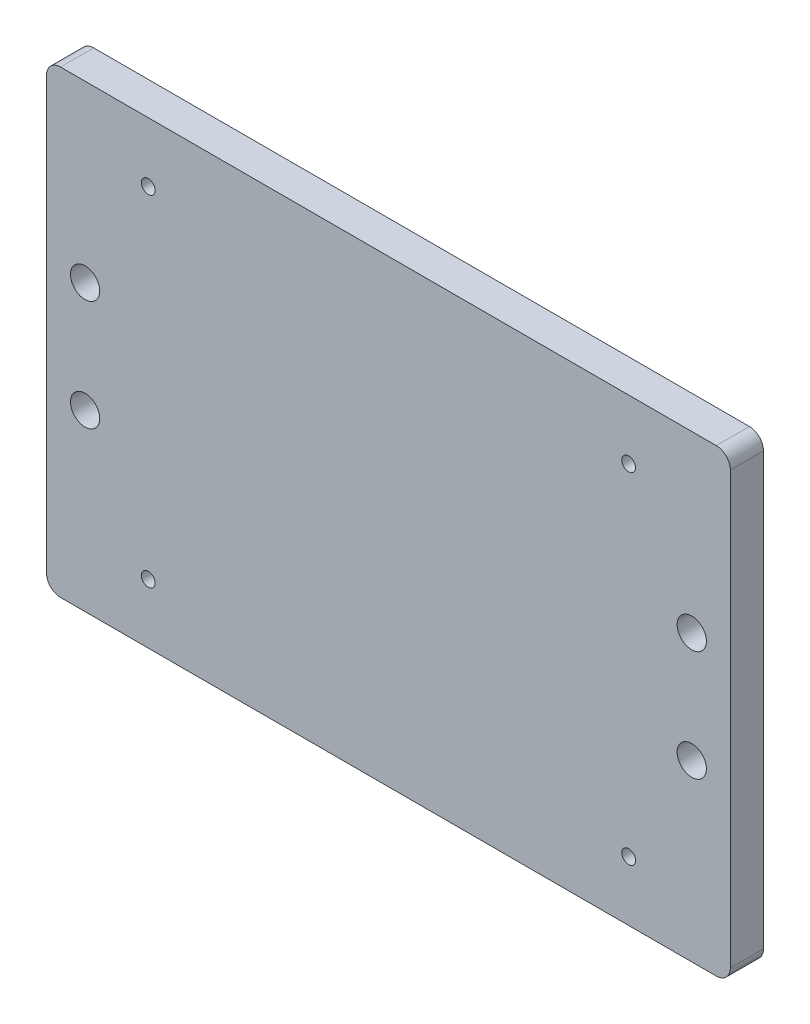
ISO-10303-21;
HEADER;
FILE_DESCRIPTION(('STEP AP214'),'2;1');
FILE_NAME('part.step','',(''),(''),'','','');
FILE_SCHEMA(('AUTOMOTIVE_DESIGN { 1 0 10303 214 1 1 1 1 }'));
ENDSEC;
DATA;
#1=APPLICATION_CONTEXT('core data for automotive mechanical design processes');
#2=APPLICATION_PROTOCOL_DEFINITION('international standard','automotive_design',2000,#1);
#3=PRODUCT_CONTEXT('',#1,'mechanical');
#4=PRODUCT('Part','Part','',(#3));
#5=PRODUCT_RELATED_PRODUCT_CATEGORY('part','',(#4));
#6=PRODUCT_DEFINITION_FORMATION('','',#4);
#7=PRODUCT_DEFINITION_CONTEXT('part definition',#1,'design');
#8=PRODUCT_DEFINITION('design','',#6,#7);
#9=PRODUCT_DEFINITION_SHAPE('','',#8);
#10=(LENGTH_UNIT() NAMED_UNIT(*) SI_UNIT(.MILLI.,.METRE.));
#11=(NAMED_UNIT(*) PLANE_ANGLE_UNIT() SI_UNIT($,.RADIAN.));
#12=(NAMED_UNIT(*) SI_UNIT($,.STERADIAN.) SOLID_ANGLE_UNIT());
#13=UNCERTAINTY_MEASURE_WITH_UNIT(LENGTH_MEASURE(1.E-05),#10,'distance_accuracy_value','');
#14=(GEOMETRIC_REPRESENTATION_CONTEXT(3) GLOBAL_UNCERTAINTY_ASSIGNED_CONTEXT((#13)) GLOBAL_UNIT_ASSIGNED_CONTEXT((#10,
#11,#12)) REPRESENTATION_CONTEXT('',''));
#15=CARTESIAN_POINT('',(0.,0.,0.));
#16=DIRECTION('',(0.,0.,1.));
#17=DIRECTION('',(1.,0.,0.));
#18=AXIS2_PLACEMENT_3D('',#15,#16,#17);
#19=CARTESIAN_POINT('',(374.269,383.413,-11.999999876));
#20=DIRECTION('',(0.,0.,1.));
#21=DIRECTION('',(1.,0.,0.));
#22=AXIS2_PLACEMENT_3D('',#19,#20,#21);
#23=PLANE('',#22);
#24=CARTESIAN_POINT('',(477.139,375.158,-11.999999876));
#25=DIRECTION('',(0.,0.,-1.));
#26=DIRECTION('',(-1.,0.,0.));
#27=AXIS2_PLACEMENT_3D('',#24,#25,#26);
#28=CIRCLE('',#27,1.24999999999997);
#29=CARTESIAN_POINT('',(475.889,375.158,-11.999999876));
#30=VERTEX_POINT('',#29);
#31=EDGE_CURVE('E231',#30,#30,#28,.T.);
#32=ORIENTED_EDGE('',*,*,#31,.T.);
#33=EDGE_LOOP('',(#32));
#34=FACE_BOUND('',#33,.T.);
#35=CARTESIAN_POINT('',(390.144,375.158,-11.999999876));
#36=DIRECTION('',(0.,0.,-1.));
#37=DIRECTION('',(-1.,0.,0.));
#38=AXIS2_PLACEMENT_3D('',#35,#36,#37);
#39=CIRCLE('',#38,1.24999999999997);
#40=CARTESIAN_POINT('',(388.894,375.158,-11.999999876));
#41=VERTEX_POINT('',#40);
#42=EDGE_CURVE('E225',#41,#41,#39,.T.);
#43=ORIENTED_EDGE('',*,*,#42,.T.);
#44=EDGE_LOOP('',(#43));
#45=FACE_BOUND('',#44,.T.);
#46=CARTESIAN_POINT('',(390.144,313.563,-11.999999876));
#47=DIRECTION('',(0.,0.,-1.));
#48=DIRECTION('',(-1.,0.,0.));
#49=AXIS2_PLACEMENT_3D('',#46,#47,#48);
#50=CIRCLE('',#49,1.24999999999997);
#51=CARTESIAN_POINT('',(388.894,313.563,-11.999999876));
#52=VERTEX_POINT('',#51);
#53=EDGE_CURVE('E219',#52,#52,#50,.T.);
#54=ORIENTED_EDGE('',*,*,#53,.T.);
#55=EDGE_LOOP('',(#54));
#56=FACE_BOUND('',#55,.T.);
#57=CARTESIAN_POINT('',(374.269,383.413,-11.999999876));
#58=DIRECTION('',(0.,0.,-1.));
#59=DIRECTION('',(1.,0.,0.));
#60=AXIS2_PLACEMENT_3D('',#57,#58,#59);
#61=CIRCLE('',#60,2.53999999999999);
#62=CARTESIAN_POINT('',(371.729,383.413,-11.999999876));
#63=VERTEX_POINT('',#62);
#64=CARTESIAN_POINT('',(374.269,385.953,-11.999999876));
#65=VERTEX_POINT('',#64);
#66=EDGE_CURVE('E140',#63,#65,#61,.T.);
#67=ORIENTED_EDGE('',*,*,#66,.F.);
#68=DIRECTION('',(0.,1.,0.));
#69=VECTOR('',#68,1.);
#70=CARTESIAN_POINT('',(371.729,383.413,-11.999999876));
#71=LINE('',#70,#69);
#72=CARTESIAN_POINT('',(371.729,305.308,-11.999999876));
#73=VERTEX_POINT('',#72);
#74=EDGE_CURVE('E95',#73,#63,#71,.T.);
#75=ORIENTED_EDGE('',*,*,#74,.F.);
#76=CARTESIAN_POINT('',(374.269,305.308,-11.999999876));
#77=DIRECTION('',(0.,0.,-1.));
#78=DIRECTION('',(-1.,0.,0.));
#79=AXIS2_PLACEMENT_3D('',#76,#77,#78);
#80=CIRCLE('',#79,2.53999999999993);
#81=CARTESIAN_POINT('',(374.269,302.768,-11.999999876));
#82=VERTEX_POINT('',#81);
#83=EDGE_CURVE('E89',#82,#73,#80,.T.);
#84=ORIENTED_EDGE('',*,*,#83,.F.);
#85=DIRECTION('',(-1.,0.,0.));
#86=VECTOR('',#85,1.);
#87=CARTESIAN_POINT('',(493.014,302.768,-11.999999876));
#88=LINE('',#87,#86);
#89=CARTESIAN_POINT('',(493.014,302.768,-11.999999876));
#90=VERTEX_POINT('',#89);
#91=EDGE_CURVE('E130',#90,#82,#88,.T.);
#92=ORIENTED_EDGE('',*,*,#91,.F.);
#93=CARTESIAN_POINT('',(493.014,305.308,-11.999999876));
#94=DIRECTION('',(0.,0.,-1.));
#95=DIRECTION('',(-1.,0.,0.));
#96=AXIS2_PLACEMENT_3D('',#93,#94,#95);
#97=CIRCLE('',#96,2.53999999999999);
#98=CARTESIAN_POINT('',(495.554,305.308,-11.999999876));
#99=VERTEX_POINT('',#98);
#100=EDGE_CURVE('E151',#99,#90,#97,.T.);
#101=ORIENTED_EDGE('',*,*,#100,.F.);
#102=DIRECTION('',(0.,-1.,0.));
#103=VECTOR('',#102,1.);
#104=CARTESIAN_POINT('',(495.554,383.413,-11.999999876));
#105=LINE('',#104,#103);
#106=CARTESIAN_POINT('',(495.554,383.413,-11.999999876));
#107=VERTEX_POINT('',#106);
#108=EDGE_CURVE('E149',#107,#99,#105,.T.);
#109=ORIENTED_EDGE('',*,*,#108,.F.);
#110=CARTESIAN_POINT('',(493.014,383.413,-11.999999876));
#111=DIRECTION('',(0.,0.,-1.));
#112=DIRECTION('',(-1.,0.,0.));
#113=AXIS2_PLACEMENT_3D('',#110,#111,#112);
#114=CIRCLE('',#113,2.53999999999999);
#115=CARTESIAN_POINT('',(493.014,385.953,-11.999999876));
#116=VERTEX_POINT('',#115);
#117=EDGE_CURVE('E147',#116,#107,#114,.T.);
#118=ORIENTED_EDGE('',*,*,#117,.F.);
#119=DIRECTION('',(1.,0.,0.));
#120=VECTOR('',#119,1.);
#121=CARTESIAN_POINT('',(493.014,385.953,-11.999999876));
#122=LINE('',#121,#120);
#123=EDGE_CURVE('E143',#65,#116,#122,.T.);
#124=ORIENTED_EDGE('',*,*,#123,.F.);
#125=EDGE_LOOP('',(#67,#75,#84,#92,#101,#109,#118,#124));
#126=FACE_BOUND('',#125,.T.);
#127=CARTESIAN_POINT('',(378.714,354.360499939,-11.999999876));
#128=DIRECTION('',(0.,0.,-1.));
#129=DIRECTION('',(-1.,0.,0.));
#130=AXIS2_PLACEMENT_3D('',#127,#128,#129);
#131=CIRCLE('',#130,2.64999999999999);
#132=CARTESIAN_POINT('',(376.064,354.360499939,-11.999999876));
#133=VERTEX_POINT('',#132);
#134=EDGE_CURVE('E144',#133,#133,#131,.T.);
#135=ORIENTED_EDGE('',*,*,#134,.T.);
#136=EDGE_LOOP('',(#135));
#137=FACE_BOUND('',#136,.T.);
#138=CARTESIAN_POINT('',(378.714,334.360500061,-11.999999876));
#139=DIRECTION('',(0.,0.,-1.));
#140=DIRECTION('',(-1.,0.,0.));
#141=AXIS2_PLACEMENT_3D('',#138,#139,#140);
#142=CIRCLE('',#141,2.64999999999999);
#143=CARTESIAN_POINT('',(376.064,334.360500061,-11.999999876));
#144=VERTEX_POINT('',#143);
#145=EDGE_CURVE('E195',#144,#144,#142,.T.);
#146=ORIENTED_EDGE('',*,*,#145,.T.);
#147=EDGE_LOOP('',(#146));
#148=FACE_BOUND('',#147,.T.);
#149=CARTESIAN_POINT('',(488.569,334.360500061,-11.999999876));
#150=DIRECTION('',(0.,0.,-1.));
#151=DIRECTION('',(-1.,0.,0.));
#152=AXIS2_PLACEMENT_3D('',#149,#150,#151);
#153=CIRCLE('',#152,2.64999999999999);
#154=CARTESIAN_POINT('',(485.919,334.360500061,-11.999999876));
#155=VERTEX_POINT('',#154);
#156=EDGE_CURVE('E201',#155,#155,#153,.T.);
#157=ORIENTED_EDGE('',*,*,#156,.T.);
#158=EDGE_LOOP('',(#157));
#159=FACE_BOUND('',#158,.T.);
#160=CARTESIAN_POINT('',(488.569,354.360499939,-11.999999876));
#161=DIRECTION('',(0.,0.,-1.));
#162=DIRECTION('',(-1.,0.,0.));
#163=AXIS2_PLACEMENT_3D('',#160,#161,#162);
#164=CIRCLE('',#163,2.64999999999999);
#165=CARTESIAN_POINT('',(485.919,354.360499939,-11.999999876));
#166=VERTEX_POINT('',#165);
#167=EDGE_CURVE('E207',#166,#166,#164,.T.);
#168=ORIENTED_EDGE('',*,*,#167,.T.);
#169=EDGE_LOOP('',(#168));
#170=FACE_BOUND('',#169,.T.);
#171=CARTESIAN_POINT('',(477.139,313.563,-11.999999876));
#172=DIRECTION('',(0.,0.,-1.));
#173=DIRECTION('',(-1.,0.,0.));
#174=AXIS2_PLACEMENT_3D('',#171,#172,#173);
#175=CIRCLE('',#174,1.24999999999997);
#176=CARTESIAN_POINT('',(475.889,313.563,-11.999999876));
#177=VERTEX_POINT('',#176);
#178=EDGE_CURVE('E213',#177,#177,#175,.T.);
#179=ORIENTED_EDGE('',*,*,#178,.T.);
#180=EDGE_LOOP('',(#179));
#181=FACE_BOUND('',#180,.T.);
#182=ADVANCED_FACE('F43',(#34,#45,#56,#126,#137,#148,#159,#170,#181),#23,.T.);
#183=CARTESIAN_POINT('',(374.269,383.413,-17.999999876));
#184=DIRECTION('',(0.,0.,1.));
#185=DIRECTION('',(1.,0.,0.));
#186=AXIS2_PLACEMENT_3D('',#183,#184,#185);
#187=CYLINDRICAL_SURFACE('',#186,2.53999999999999);
#188=ORIENTED_EDGE('',*,*,#66,.T.);
#189=DIRECTION('',(0.,0.,1.));
#190=VECTOR('',#189,1.);
#191=CARTESIAN_POINT('',(374.269,385.953,-17.999999876));
#192=LINE('',#191,#190);
#193=CARTESIAN_POINT('',(374.269,385.953,-17.999999876));
#194=VERTEX_POINT('',#193);
#195=EDGE_CURVE('E11',#194,#65,#192,.T.);
#196=ORIENTED_EDGE('',*,*,#195,.F.);
#197=CARTESIAN_POINT('',(374.269,383.413,-17.999999876));
#198=DIRECTION('',(0.,0.,-1.));
#199=DIRECTION('',(1.,0.,0.));
#200=AXIS2_PLACEMENT_3D('',#197,#198,#199);
#201=CIRCLE('',#200,2.53999999999999);
#202=CARTESIAN_POINT('',(371.729,383.413,-17.999999876));
#203=VERTEX_POINT('',#202);
#204=EDGE_CURVE('E156',#203,#194,#201,.T.);
#205=ORIENTED_EDGE('',*,*,#204,.F.);
#206=DIRECTION('',(0.,0.,1.));
#207=VECTOR('',#206,1.);
#208=CARTESIAN_POINT('',(371.729,383.413,-17.999999876));
#209=LINE('',#208,#207);
#210=EDGE_CURVE('E136',#203,#63,#209,.T.);
#211=ORIENTED_EDGE('',*,*,#210,.T.);
#212=EDGE_LOOP('',(#188,#196,#205,#211));
#213=FACE_BOUND('',#212,.T.);
#214=ADVANCED_FACE('F45',(#213),#187,.T.);
#215=CARTESIAN_POINT('',(493.014,385.953,-17.999999876));
#216=DIRECTION('',(0.,-1.,0.));
#217=DIRECTION('',(0.,0.,-1.));
#218=AXIS2_PLACEMENT_3D('',#215,#216,#217);
#219=PLANE('',#218);
#220=ORIENTED_EDGE('',*,*,#123,.T.);
#221=DIRECTION('',(0.,0.,1.));
#222=VECTOR('',#221,1.);
#223=CARTESIAN_POINT('',(493.014,385.953,-17.999999876));
#224=LINE('',#223,#222);
#225=CARTESIAN_POINT('',(493.014,385.953,-17.999999876));
#226=VERTEX_POINT('',#225);
#227=EDGE_CURVE('E52',#226,#116,#224,.T.);
#228=ORIENTED_EDGE('',*,*,#227,.F.);
#229=DIRECTION('',(1.,0.,0.));
#230=VECTOR('',#229,1.);
#231=CARTESIAN_POINT('',(493.014,385.953,-17.999999876));
#232=LINE('',#231,#230);
#233=EDGE_CURVE('E103',#194,#226,#232,.T.);
#234=ORIENTED_EDGE('',*,*,#233,.F.);
#235=ORIENTED_EDGE('',*,*,#195,.T.);
#236=EDGE_LOOP('',(#220,#228,#234,#235));
#237=FACE_BOUND('',#236,.T.);
#238=ADVANCED_FACE('F278',(#237),#219,.F.);
#239=CARTESIAN_POINT('',(493.014,383.413,-17.999999876));
#240=DIRECTION('',(0.,0.,1.));
#241=DIRECTION('',(1.,0.,0.));
#242=AXIS2_PLACEMENT_3D('',#239,#240,#241);
#243=CYLINDRICAL_SURFACE('',#242,2.53999999999999);
#244=ORIENTED_EDGE('',*,*,#117,.T.);
#245=DIRECTION('',(0.,0.,1.));
#246=VECTOR('',#245,1.);
#247=CARTESIAN_POINT('',(495.554,383.413,-17.999999876));
#248=LINE('',#247,#246);
#249=CARTESIAN_POINT('',(495.554,383.413,-17.999999876));
#250=VERTEX_POINT('',#249);
#251=EDGE_CURVE('E163',#250,#107,#248,.T.);
#252=ORIENTED_EDGE('',*,*,#251,.F.);
#253=CARTESIAN_POINT('',(493.014,383.413,-17.999999876));
#254=DIRECTION('',(0.,0.,-1.));
#255=DIRECTION('',(-1.,0.,0.));
#256=AXIS2_PLACEMENT_3D('',#253,#254,#255);
#257=CIRCLE('',#256,2.53999999999999);
#258=EDGE_CURVE('E171',#226,#250,#257,.T.);
#259=ORIENTED_EDGE('',*,*,#258,.F.);
#260=ORIENTED_EDGE('',*,*,#227,.T.);
#261=EDGE_LOOP('',(#244,#252,#259,#260));
#262=FACE_BOUND('',#261,.T.);
#263=ADVANCED_FACE('F169',(#262),#243,.T.);
#264=CARTESIAN_POINT('',(495.554,383.413,-17.999999876));
#265=DIRECTION('',(-1.,0.,0.));
#266=DIRECTION('',(0.,-1.,0.));
#267=AXIS2_PLACEMENT_3D('',#264,#265,#266);
#268=PLANE('',#267);
#269=ORIENTED_EDGE('',*,*,#108,.T.);
#270=DIRECTION('',(0.,0.,1.));
#271=VECTOR('',#270,1.);
#272=CARTESIAN_POINT('',(495.554,305.308,-17.999999876));
#273=LINE('',#272,#271);
#274=CARTESIAN_POINT('',(495.554,305.308,-17.999999876));
#275=VERTEX_POINT('',#274);
#276=EDGE_CURVE('E160',#275,#99,#273,.T.);
#277=ORIENTED_EDGE('',*,*,#276,.F.);
#278=DIRECTION('',(0.,-1.,0.));
#279=VECTOR('',#278,1.);
#280=CARTESIAN_POINT('',(495.554,383.413,-17.999999876));
#281=LINE('',#280,#279);
#282=EDGE_CURVE('E183',#250,#275,#281,.T.);
#283=ORIENTED_EDGE('',*,*,#282,.F.);
#284=ORIENTED_EDGE('',*,*,#251,.T.);
#285=EDGE_LOOP('',(#269,#277,#283,#284));
#286=FACE_BOUND('',#285,.T.);
#287=ADVANCED_FACE('F179',(#286),#268,.F.);
#288=CARTESIAN_POINT('',(493.014,305.308,-17.999999876));
#289=DIRECTION('',(0.,0.,1.));
#290=DIRECTION('',(1.,0.,0.));
#291=AXIS2_PLACEMENT_3D('',#288,#289,#290);
#292=CYLINDRICAL_SURFACE('',#291,2.53999999999999);
#293=ORIENTED_EDGE('',*,*,#100,.T.);
#294=DIRECTION('',(0.,0.,1.));
#295=VECTOR('',#294,1.);
#296=CARTESIAN_POINT('',(493.014,302.768,-17.999999876));
#297=LINE('',#296,#295);
#298=CARTESIAN_POINT('',(493.014,302.768,-17.999999876));
#299=VERTEX_POINT('',#298);
#300=EDGE_CURVE('E131',#299,#90,#297,.T.);
#301=ORIENTED_EDGE('',*,*,#300,.F.);
#302=CARTESIAN_POINT('',(493.014,305.308,-17.999999876));
#303=DIRECTION('',(0.,0.,-1.));
#304=DIRECTION('',(-1.,0.,0.));
#305=AXIS2_PLACEMENT_3D('',#302,#303,#304);
#306=CIRCLE('',#305,2.53999999999999);
#307=EDGE_CURVE('E122',#275,#299,#306,.T.);
#308=ORIENTED_EDGE('',*,*,#307,.F.);
#309=ORIENTED_EDGE('',*,*,#276,.T.);
#310=EDGE_LOOP('',(#293,#301,#308,#309));
#311=FACE_BOUND('',#310,.T.);
#312=ADVANCED_FACE('F182',(#311),#292,.T.);
#313=CARTESIAN_POINT('',(493.014,302.768,-17.999999876));
#314=DIRECTION('',(0.,1.,0.));
#315=DIRECTION('',(-1.,0.,0.));
#316=AXIS2_PLACEMENT_3D('',#313,#314,#315);
#317=PLANE('',#316);
#318=ORIENTED_EDGE('',*,*,#91,.T.);
#319=DIRECTION('',(0.,0.,1.));
#320=VECTOR('',#319,1.);
#321=CARTESIAN_POINT('',(374.269,302.768,-17.999999876));
#322=LINE('',#321,#320);
#323=CARTESIAN_POINT('',(374.269,302.768,-17.999999876));
#324=VERTEX_POINT('',#323);
#325=EDGE_CURVE('E127',#324,#82,#322,.T.);
#326=ORIENTED_EDGE('',*,*,#325,.F.);
#327=DIRECTION('',(-1.,0.,0.));
#328=VECTOR('',#327,1.);
#329=CARTESIAN_POINT('',(493.014,302.768,-17.999999876));
#330=LINE('',#329,#328);
#331=EDGE_CURVE('E116',#299,#324,#330,.T.);
#332=ORIENTED_EDGE('',*,*,#331,.F.);
#333=ORIENTED_EDGE('',*,*,#300,.T.);
#334=EDGE_LOOP('',(#318,#326,#332,#333));
#335=FACE_BOUND('',#334,.T.);
#336=ADVANCED_FACE('F128',(#335),#317,.F.);
#337=CARTESIAN_POINT('',(374.269,305.308,-17.999999876));
#338=DIRECTION('',(0.,0.,1.));
#339=DIRECTION('',(1.,0.,0.));
#340=AXIS2_PLACEMENT_3D('',#337,#338,#339);
#341=CYLINDRICAL_SURFACE('',#340,2.53999999999993);
#342=ORIENTED_EDGE('',*,*,#83,.T.);
#343=DIRECTION('',(0.,0.,1.));
#344=VECTOR('',#343,1.);
#345=CARTESIAN_POINT('',(371.729,305.308,-17.999999876));
#346=LINE('',#345,#344);
#347=CARTESIAN_POINT('',(371.729,305.308,-17.999999876));
#348=VERTEX_POINT('',#347);
#349=EDGE_CURVE('E132',#348,#73,#346,.T.);
#350=ORIENTED_EDGE('',*,*,#349,.F.);
#351=CARTESIAN_POINT('',(374.269,305.308,-17.999999876));
#352=DIRECTION('',(0.,0.,-1.));
#353=DIRECTION('',(-1.,0.,0.));
#354=AXIS2_PLACEMENT_3D('',#351,#352,#353);
#355=CIRCLE('',#354,2.53999999999993);
#356=EDGE_CURVE('E120',#324,#348,#355,.T.);
#357=ORIENTED_EDGE('',*,*,#356,.F.);
#358=ORIENTED_EDGE('',*,*,#325,.T.);
#359=EDGE_LOOP('',(#342,#350,#357,#358));
#360=FACE_BOUND('',#359,.T.);
#361=ADVANCED_FACE('F134',(#360),#341,.T.);
#362=CARTESIAN_POINT('',(371.729,383.413,-17.999999876));
#363=DIRECTION('',(1.,0.,0.));
#364=DIRECTION('',(0.,1.,0.));
#365=AXIS2_PLACEMENT_3D('',#362,#363,#364);
#366=PLANE('',#365);
#367=ORIENTED_EDGE('',*,*,#74,.T.);
#368=ORIENTED_EDGE('',*,*,#210,.F.);
#369=DIRECTION('',(0.,1.,0.));
#370=VECTOR('',#369,1.);
#371=CARTESIAN_POINT('',(371.729,383.413,-17.999999876));
#372=LINE('',#371,#370);
#373=EDGE_CURVE('E60',#348,#203,#372,.T.);
#374=ORIENTED_EDGE('',*,*,#373,.F.);
#375=ORIENTED_EDGE('',*,*,#349,.T.);
#376=EDGE_LOOP('',(#367,#368,#374,#375));
#377=FACE_BOUND('',#376,.T.);
#378=ADVANCED_FACE('F243',(#377),#366,.F.);
#379=CARTESIAN_POINT('',(374.269,383.413,-17.999999876));
#380=DIRECTION('',(0.,0.,1.));
#381=DIRECTION('',(1.,0.,0.));
#382=AXIS2_PLACEMENT_3D('',#379,#380,#381);
#383=PLANE('',#382);
#384=CARTESIAN_POINT('',(477.139,375.158,-17.999999876));
#385=DIRECTION('',(0.,0.,-1.));
#386=DIRECTION('',(-1.,0.,0.));
#387=AXIS2_PLACEMENT_3D('',#384,#385,#386);
#388=CIRCLE('',#387,1.24999999999997);
#389=CARTESIAN_POINT('',(475.889,375.158,-17.999999876));
#390=VERTEX_POINT('',#389);
#391=EDGE_CURVE('E234',#390,#390,#388,.T.);
#392=ORIENTED_EDGE('',*,*,#391,.F.);
#393=EDGE_LOOP('',(#392));
#394=FACE_BOUND('',#393,.T.);
#395=CARTESIAN_POINT('',(390.144,375.158,-17.999999876));
#396=DIRECTION('',(0.,0.,-1.));
#397=DIRECTION('',(-1.,0.,0.));
#398=AXIS2_PLACEMENT_3D('',#395,#396,#397);
#399=CIRCLE('',#398,1.24999999999997);
#400=CARTESIAN_POINT('',(388.894,375.158,-17.999999876));
#401=VERTEX_POINT('',#400);
#402=EDGE_CURVE('E228',#401,#401,#399,.T.);
#403=ORIENTED_EDGE('',*,*,#402,.F.);
#404=EDGE_LOOP('',(#403));
#405=FACE_BOUND('',#404,.T.);
#406=CARTESIAN_POINT('',(390.144,313.563,-17.999999876));
#407=DIRECTION('',(0.,0.,-1.));
#408=DIRECTION('',(-1.,0.,0.));
#409=AXIS2_PLACEMENT_3D('',#406,#407,#408);
#410=CIRCLE('',#409,1.24999999999997);
#411=CARTESIAN_POINT('',(388.894,313.563,-17.999999876));
#412=VERTEX_POINT('',#411);
#413=EDGE_CURVE('E222',#412,#412,#410,.T.);
#414=ORIENTED_EDGE('',*,*,#413,.F.);
#415=EDGE_LOOP('',(#414));
#416=FACE_BOUND('',#415,.T.);
#417=CARTESIAN_POINT('',(477.139,313.563,-17.999999876));
#418=DIRECTION('',(0.,0.,-1.));
#419=DIRECTION('',(-1.,0.,0.));
#420=AXIS2_PLACEMENT_3D('',#417,#418,#419);
#421=CIRCLE('',#420,1.24999999999997);
#422=CARTESIAN_POINT('',(475.889,313.563,-17.999999876));
#423=VERTEX_POINT('',#422);
#424=EDGE_CURVE('E216',#423,#423,#421,.T.);
#425=ORIENTED_EDGE('',*,*,#424,.F.);
#426=EDGE_LOOP('',(#425));
#427=FACE_BOUND('',#426,.T.);
#428=CARTESIAN_POINT('',(488.569,354.360499939,-17.999999876));
#429=DIRECTION('',(0.,0.,-1.));
#430=DIRECTION('',(-1.,0.,0.));
#431=AXIS2_PLACEMENT_3D('',#428,#429,#430);
#432=CIRCLE('',#431,2.64999999999999);
#433=CARTESIAN_POINT('',(485.919,354.360499939,-17.999999876));
#434=VERTEX_POINT('',#433);
#435=EDGE_CURVE('E210',#434,#434,#432,.T.);
#436=ORIENTED_EDGE('',*,*,#435,.F.);
#437=EDGE_LOOP('',(#436));
#438=FACE_BOUND('',#437,.T.);
#439=CARTESIAN_POINT('',(488.569,334.360500061,-17.999999876));
#440=DIRECTION('',(0.,0.,-1.));
#441=DIRECTION('',(-1.,0.,0.));
#442=AXIS2_PLACEMENT_3D('',#439,#440,#441);
#443=CIRCLE('',#442,2.64999999999999);
#444=CARTESIAN_POINT('',(485.919,334.360500061,-17.999999876));
#445=VERTEX_POINT('',#444);
#446=EDGE_CURVE('E204',#445,#445,#443,.T.);
#447=ORIENTED_EDGE('',*,*,#446,.F.);
#448=EDGE_LOOP('',(#447));
#449=FACE_BOUND('',#448,.T.);
#450=CARTESIAN_POINT('',(378.714,334.360500061,-17.999999876));
#451=DIRECTION('',(0.,0.,-1.));
#452=DIRECTION('',(-1.,0.,0.));
#453=AXIS2_PLACEMENT_3D('',#450,#451,#452);
#454=CIRCLE('',#453,2.64999999999999);
#455=CARTESIAN_POINT('',(376.064,334.360500061,-17.999999876));
#456=VERTEX_POINT('',#455);
#457=EDGE_CURVE('E198',#456,#456,#454,.T.);
#458=ORIENTED_EDGE('',*,*,#457,.F.);
#459=EDGE_LOOP('',(#458));
#460=FACE_BOUND('',#459,.T.);
#461=CARTESIAN_POINT('',(378.714,354.360499939,-17.999999876));
#462=DIRECTION('',(0.,0.,-1.));
#463=DIRECTION('',(-1.,0.,0.));
#464=AXIS2_PLACEMENT_3D('',#461,#462,#463);
#465=CIRCLE('',#464,2.64999999999999);
#466=CARTESIAN_POINT('',(376.064,354.360499939,-17.999999876));
#467=VERTEX_POINT('',#466);
#468=EDGE_CURVE('E192',#467,#467,#465,.T.);
#469=ORIENTED_EDGE('',*,*,#468,.F.);
#470=EDGE_LOOP('',(#469));
#471=FACE_BOUND('',#470,.T.);
#472=ORIENTED_EDGE('',*,*,#204,.T.);
#473=ORIENTED_EDGE('',*,*,#233,.T.);
#474=ORIENTED_EDGE('',*,*,#258,.T.);
#475=ORIENTED_EDGE('',*,*,#282,.T.);
#476=ORIENTED_EDGE('',*,*,#307,.T.);
#477=ORIENTED_EDGE('',*,*,#331,.T.);
#478=ORIENTED_EDGE('',*,*,#356,.T.);
#479=ORIENTED_EDGE('',*,*,#373,.T.);
#480=EDGE_LOOP('',(#472,#473,#474,#475,#476,#477,#478,#479));
#481=FACE_BOUND('',#480,.T.);
#482=ADVANCED_FACE('F118',(#394,#405,#416,#427,#438,#449,#460,#471,#481),#383,.F.);
#483=CARTESIAN_POINT('',(378.714,354.360499939,-17.999999876));
#484=DIRECTION('',(0.,0.,-1.));
#485=DIRECTION('',(-1.,0.,0.));
#486=AXIS2_PLACEMENT_3D('',#483,#484,#485);
#487=CYLINDRICAL_SURFACE('',#486,2.64999999999999);
#488=ORIENTED_EDGE('',*,*,#134,.F.);
#489=EDGE_LOOP('',(#488));
#490=FACE_BOUND('',#489,.T.);
#491=ORIENTED_EDGE('',*,*,#468,.T.);
#492=EDGE_LOOP('',(#491));
#493=FACE_BOUND('',#492,.T.);
#494=ADVANCED_FACE('F242',(#490,#493),#487,.F.);
#495=CARTESIAN_POINT('',(378.714,334.360500061,-17.999999876));
#496=DIRECTION('',(0.,0.,-1.));
#497=DIRECTION('',(-1.,0.,0.));
#498=AXIS2_PLACEMENT_3D('',#495,#496,#497);
#499=CYLINDRICAL_SURFACE('',#498,2.64999999999999);
#500=ORIENTED_EDGE('',*,*,#145,.F.);
#501=EDGE_LOOP('',(#500));
#502=FACE_BOUND('',#501,.T.);
#503=ORIENTED_EDGE('',*,*,#457,.T.);
#504=EDGE_LOOP('',(#503));
#505=FACE_BOUND('',#504,.T.);
#506=ADVANCED_FACE('F260',(#502,#505),#499,.F.);
#507=CARTESIAN_POINT('',(488.569,334.360500061,-17.999999876));
#508=DIRECTION('',(0.,0.,-1.));
#509=DIRECTION('',(-1.,0.,0.));
#510=AXIS2_PLACEMENT_3D('',#507,#508,#509);
#511=CYLINDRICAL_SURFACE('',#510,2.64999999999999);
#512=ORIENTED_EDGE('',*,*,#156,.F.);
#513=EDGE_LOOP('',(#512));
#514=FACE_BOUND('',#513,.T.);
#515=ORIENTED_EDGE('',*,*,#446,.T.);
#516=EDGE_LOOP('',(#515));
#517=FACE_BOUND('',#516,.T.);
#518=ADVANCED_FACE('F267',(#514,#517),#511,.F.);
#519=CARTESIAN_POINT('',(488.569,354.360499939,-17.999999876));
#520=DIRECTION('',(0.,0.,-1.));
#521=DIRECTION('',(-1.,0.,0.));
#522=AXIS2_PLACEMENT_3D('',#519,#520,#521);
#523=CYLINDRICAL_SURFACE('',#522,2.64999999999999);
#524=ORIENTED_EDGE('',*,*,#167,.F.);
#525=EDGE_LOOP('',(#524));
#526=FACE_BOUND('',#525,.T.);
#527=ORIENTED_EDGE('',*,*,#435,.T.);
#528=EDGE_LOOP('',(#527));
#529=FACE_BOUND('',#528,.T.);
#530=ADVANCED_FACE('F356',(#526,#529),#523,.F.);
#531=CARTESIAN_POINT('',(477.139,313.563,-17.999999876));
#532=DIRECTION('',(0.,0.,-1.));
#533=DIRECTION('',(-1.,0.,0.));
#534=AXIS2_PLACEMENT_3D('',#531,#532,#533);
#535=CYLINDRICAL_SURFACE('',#534,1.24999999999997);
#536=ORIENTED_EDGE('',*,*,#178,.F.);
#537=EDGE_LOOP('',(#536));
#538=FACE_BOUND('',#537,.T.);
#539=ORIENTED_EDGE('',*,*,#424,.T.);
#540=EDGE_LOOP('',(#539));
#541=FACE_BOUND('',#540,.T.);
#542=ADVANCED_FACE('F365',(#538,#541),#535,.F.);
#543=CARTESIAN_POINT('',(390.144,313.563,-17.999999876));
#544=DIRECTION('',(0.,0.,-1.));
#545=DIRECTION('',(-1.,0.,0.));
#546=AXIS2_PLACEMENT_3D('',#543,#544,#545);
#547=CYLINDRICAL_SURFACE('',#546,1.24999999999997);
#548=ORIENTED_EDGE('',*,*,#53,.F.);
#549=EDGE_LOOP('',(#548));
#550=FACE_BOUND('',#549,.T.);
#551=ORIENTED_EDGE('',*,*,#413,.T.);
#552=EDGE_LOOP('',(#551));
#553=FACE_BOUND('',#552,.T.);
#554=ADVANCED_FACE('F378',(#550,#553),#547,.F.);
#555=CARTESIAN_POINT('',(390.144,375.158,-17.999999876));
#556=DIRECTION('',(0.,0.,-1.));
#557=DIRECTION('',(-1.,0.,0.));
#558=AXIS2_PLACEMENT_3D('',#555,#556,#557);
#559=CYLINDRICAL_SURFACE('',#558,1.24999999999997);
#560=ORIENTED_EDGE('',*,*,#42,.F.);
#561=EDGE_LOOP('',(#560));
#562=FACE_BOUND('',#561,.T.);
#563=ORIENTED_EDGE('',*,*,#402,.T.);
#564=EDGE_LOOP('',(#563));
#565=FACE_BOUND('',#564,.T.);
#566=ADVANCED_FACE('F388',(#562,#565),#559,.F.);
#567=CARTESIAN_POINT('',(477.139,375.158,-17.999999876));
#568=DIRECTION('',(0.,0.,-1.));
#569=DIRECTION('',(-1.,0.,0.));
#570=AXIS2_PLACEMENT_3D('',#567,#568,#569);
#571=CYLINDRICAL_SURFACE('',#570,1.24999999999997);
#572=ORIENTED_EDGE('',*,*,#31,.F.);
#573=EDGE_LOOP('',(#572));
#574=FACE_BOUND('',#573,.T.);
#575=ORIENTED_EDGE('',*,*,#391,.T.);
#576=EDGE_LOOP('',(#575));
#577=FACE_BOUND('',#576,.T.);
#578=ADVANCED_FACE('F238',(#574,#577),#571,.F.);
#579=CLOSED_SHELL('',(#182,#214,#238,#263,#287,#312,#336,#361,#378,#482,#494,#506,#518,#530,
#542,#554,#566,#578));
#580=MANIFOLD_SOLID_BREP('B2',#579);
#581=ADVANCED_BREP_SHAPE_REPRESENTATION('',(#18,#580),#14);
#582=SHAPE_DEFINITION_REPRESENTATION(#9,#581);
ENDSEC;
END-ISO-10303-21;
